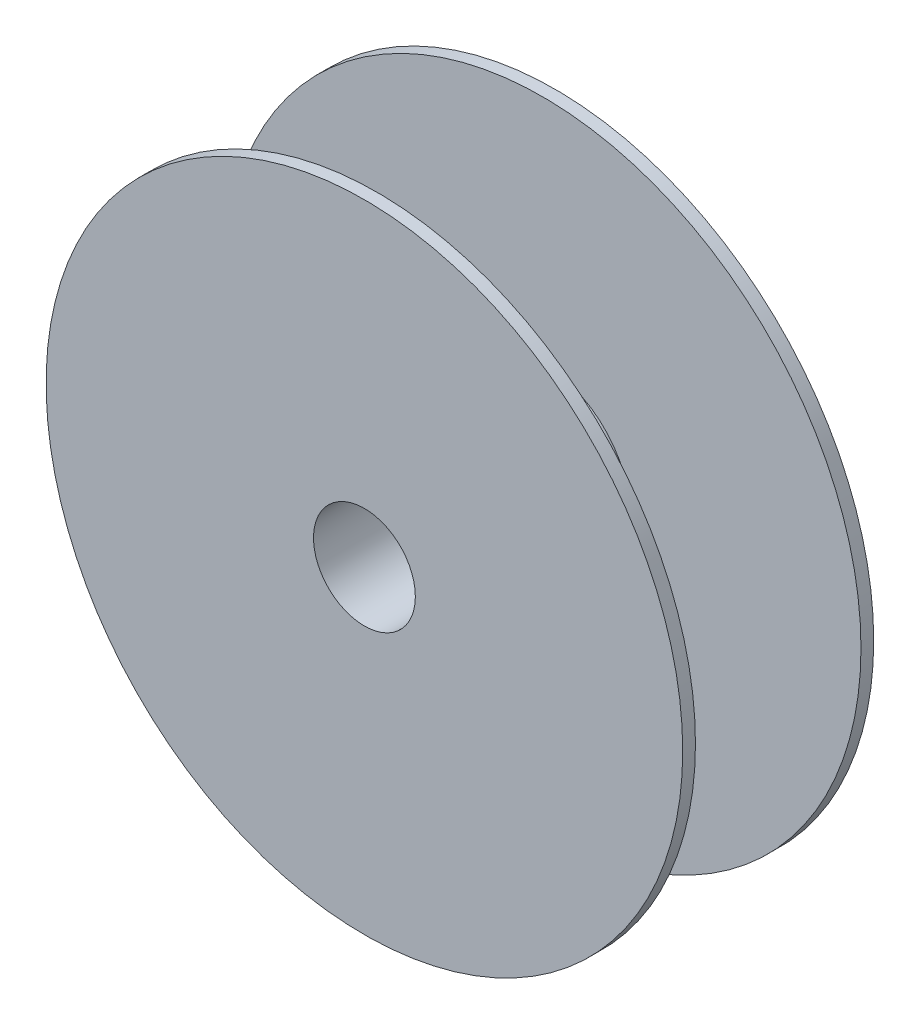
ISO-10303-21;
HEADER;
FILE_DESCRIPTION(('STEP AP214'),'2;1');
FILE_NAME('part.step','',(''),(''),'','','');
FILE_SCHEMA(('AUTOMOTIVE_DESIGN { 1 0 10303 214 1 1 1 1 }'));
ENDSEC;
DATA;
#1=APPLICATION_CONTEXT('core data for automotive mechanical design processes');
#2=APPLICATION_PROTOCOL_DEFINITION('international standard','automotive_design',2000,#1);
#3=PRODUCT_CONTEXT('',#1,'mechanical');
#4=PRODUCT('Part','Part','',(#3));
#5=PRODUCT_RELATED_PRODUCT_CATEGORY('part','',(#4));
#6=PRODUCT_DEFINITION_FORMATION('','',#4);
#7=PRODUCT_DEFINITION_CONTEXT('part definition',#1,'design');
#8=PRODUCT_DEFINITION('design','',#6,#7);
#9=PRODUCT_DEFINITION_SHAPE('','',#8);
#10=(LENGTH_UNIT() NAMED_UNIT(*) SI_UNIT(.MILLI.,.METRE.));
#11=(NAMED_UNIT(*) PLANE_ANGLE_UNIT() SI_UNIT($,.RADIAN.));
#12=(NAMED_UNIT(*) SI_UNIT($,.STERADIAN.) SOLID_ANGLE_UNIT());
#13=UNCERTAINTY_MEASURE_WITH_UNIT(LENGTH_MEASURE(1.E-05),#10,'distance_accuracy_value','');
#14=(GEOMETRIC_REPRESENTATION_CONTEXT(3) GLOBAL_UNCERTAINTY_ASSIGNED_CONTEXT((#13)) GLOBAL_UNIT_ASSIGNED_CONTEXT((#10,
#11,#12)) REPRESENTATION_CONTEXT('',''));
#15=CARTESIAN_POINT('',(0.,0.,0.));
#16=DIRECTION('',(0.,0.,1.));
#17=DIRECTION('',(1.,0.,0.));
#18=AXIS2_PLACEMENT_3D('',#15,#16,#17);
#19=CARTESIAN_POINT('',(0.,0.,30.));
#20=DIRECTION('',(0.,0.,-1.));
#21=DIRECTION('',(-1.,0.,0.));
#22=AXIS2_PLACEMENT_3D('',#19,#20,#21);
#23=CYLINDRICAL_SURFACE('',#22,100.);
#24=CARTESIAN_POINT('',(0.,0.,-30.));
#25=DIRECTION('',(0.,0.,1.));
#26=DIRECTION('',(1.,0.,0.));
#27=AXIS2_PLACEMENT_3D('',#24,#25,#26);
#28=CIRCLE('',#27,100.);
#29=CARTESIAN_POINT('',(100.,0.,-30.));
#30=VERTEX_POINT('',#29);
#31=EDGE_CURVE('E54',#30,#30,#28,.T.);
#32=ORIENTED_EDGE('',*,*,#31,.T.);
#33=EDGE_LOOP('',(#32));
#34=FACE_BOUND('',#33,.T.);
#35=CARTESIAN_POINT('',(0.,0.,-26.));
#36=DIRECTION('',(0.,0.,1.));
#37=DIRECTION('',(1.,0.,0.));
#38=AXIS2_PLACEMENT_3D('',#35,#36,#37);
#39=CIRCLE('',#38,100.);
#40=CARTESIAN_POINT('',(100.,0.,-26.));
#41=VERTEX_POINT('',#40);
#42=EDGE_CURVE('E56',#41,#41,#39,.T.);
#43=ORIENTED_EDGE('',*,*,#42,.F.);
#44=EDGE_LOOP('',(#43));
#45=FACE_BOUND('',#44,.T.);
#46=ADVANCED_FACE('F39',(#34,#45),#23,.T.);
#47=CARTESIAN_POINT('',(0.,0.,26.));
#48=DIRECTION('',(0.,0.,1.));
#49=DIRECTION('',(1.,0.,0.));
#50=AXIS2_PLACEMENT_3D('',#47,#48,#49);
#51=CIRCLE('',#50,100.);
#52=CARTESIAN_POINT('',(100.,0.,26.));
#53=VERTEX_POINT('',#52);
#54=EDGE_CURVE('E61',#53,#53,#51,.T.);
#55=ORIENTED_EDGE('',*,*,#54,.T.);
#56=EDGE_LOOP('',(#55));
#57=FACE_BOUND('',#56,.T.);
#58=CARTESIAN_POINT('',(0.,0.,30.));
#59=DIRECTION('',(0.,0.,1.));
#60=DIRECTION('',(1.,0.,0.));
#61=AXIS2_PLACEMENT_3D('',#58,#59,#60);
#62=CIRCLE('',#61,100.);
#63=CARTESIAN_POINT('',(100.,0.,30.));
#64=VERTEX_POINT('',#63);
#65=EDGE_CURVE('E47',#64,#64,#62,.T.);
#66=ORIENTED_EDGE('',*,*,#65,.F.);
#67=EDGE_LOOP('',(#66));
#68=FACE_BOUND('',#67,.T.);
#69=ADVANCED_FACE('F41',(#57,#68),#23,.T.);
#70=CARTESIAN_POINT('',(0.,0.,30.));
#71=DIRECTION('',(0.,0.,-1.));
#72=DIRECTION('',(-1.,0.,0.));
#73=AXIS2_PLACEMENT_3D('',#70,#71,#72);
#74=CYLINDRICAL_SURFACE('',#73,16.0000000040004);
#75=CARTESIAN_POINT('',(0.,0.,30.));
#76=DIRECTION('',(0.,0.,1.));
#77=DIRECTION('',(1.,0.,0.));
#78=AXIS2_PLACEMENT_3D('',#75,#76,#77);
#79=CIRCLE('',#78,16.0000000040004);
#80=CARTESIAN_POINT('',(16.0000000040004,0.,30.));
#81=VERTEX_POINT('',#80);
#82=EDGE_CURVE('E10',#81,#81,#79,.T.);
#83=ORIENTED_EDGE('',*,*,#82,.T.);
#84=EDGE_LOOP('',(#83));
#85=FACE_BOUND('',#84,.T.);
#86=CARTESIAN_POINT('',(0.,0.,-30.));
#87=DIRECTION('',(0.,0.,1.));
#88=DIRECTION('',(1.,0.,0.));
#89=AXIS2_PLACEMENT_3D('',#86,#87,#88);
#90=CIRCLE('',#89,16.0000000040004);
#91=CARTESIAN_POINT('',(16.0000000040004,0.,-30.));
#92=VERTEX_POINT('',#91);
#93=EDGE_CURVE('E43',#92,#92,#90,.T.);
#94=ORIENTED_EDGE('',*,*,#93,.F.);
#95=EDGE_LOOP('',(#94));
#96=FACE_BOUND('',#95,.T.);
#97=ADVANCED_FACE('F96',(#85,#96),#74,.F.);
#98=CARTESIAN_POINT('',(0.,0.,30.));
#99=DIRECTION('',(0.,0.,1.));
#100=DIRECTION('',(1.,0.,0.));
#101=AXIS2_PLACEMENT_3D('',#98,#99,#100);
#102=PLANE('',#101);
#103=ORIENTED_EDGE('',*,*,#65,.T.);
#104=EDGE_LOOP('',(#103));
#105=FACE_BOUND('',#104,.T.);
#106=ORIENTED_EDGE('',*,*,#82,.F.);
#107=EDGE_LOOP('',(#106));
#108=FACE_BOUND('',#107,.T.);
#109=ADVANCED_FACE('F88',(#105,#108),#102,.T.);
#110=CARTESIAN_POINT('',(0.,0.,-30.));
#111=DIRECTION('',(0.,0.,1.));
#112=DIRECTION('',(1.,0.,0.));
#113=AXIS2_PLACEMENT_3D('',#110,#111,#112);
#114=PLANE('',#113);
#115=ORIENTED_EDGE('',*,*,#31,.F.);
#116=EDGE_LOOP('',(#115));
#117=FACE_BOUND('',#116,.T.);
#118=ORIENTED_EDGE('',*,*,#93,.T.);
#119=EDGE_LOOP('',(#118));
#120=FACE_BOUND('',#119,.T.);
#121=ADVANCED_FACE('F80',(#117,#120),#114,.F.);
#122=CARTESIAN_POINT('',(0.,0.,-26.));
#123=DIRECTION('',(0.,0.,1.));
#124=DIRECTION('',(1.,0.,0.));
#125=AXIS2_PLACEMENT_3D('',#122,#123,#124);
#126=PLANE('',#125);
#127=CARTESIAN_POINT('',(0.,0.,-26.));
#128=DIRECTION('',(0.,0.,1.));
#129=DIRECTION('',(1.,0.,0.));
#130=AXIS2_PLACEMENT_3D('',#127,#128,#129);
#131=CIRCLE('',#130,27.5);
#132=CARTESIAN_POINT('',(27.5,0.,-26.));
#133=VERTEX_POINT('',#132);
#134=EDGE_CURVE('E66',#133,#133,#131,.T.);
#135=ORIENTED_EDGE('',*,*,#134,.F.);
#136=EDGE_LOOP('',(#135));
#137=FACE_BOUND('',#136,.T.);
#138=ORIENTED_EDGE('',*,*,#42,.T.);
#139=EDGE_LOOP('',(#138));
#140=FACE_BOUND('',#139,.T.);
#141=ADVANCED_FACE('F77',(#137,#140),#126,.T.);
#142=CARTESIAN_POINT('',(0.,0.,26.));
#143=DIRECTION('',(0.,0.,1.));
#144=DIRECTION('',(1.,0.,0.));
#145=AXIS2_PLACEMENT_3D('',#142,#143,#144);
#146=PLANE('',#145);
#147=CARTESIAN_POINT('',(0.,0.,26.));
#148=DIRECTION('',(0.,0.,1.));
#149=DIRECTION('',(1.,0.,0.));
#150=AXIS2_PLACEMENT_3D('',#147,#148,#149);
#151=CIRCLE('',#150,27.5);
#152=CARTESIAN_POINT('',(27.5,0.,26.));
#153=VERTEX_POINT('',#152);
#154=EDGE_CURVE('E68',#153,#153,#151,.T.);
#155=ORIENTED_EDGE('',*,*,#154,.T.);
#156=EDGE_LOOP('',(#155));
#157=FACE_BOUND('',#156,.T.);
#158=ORIENTED_EDGE('',*,*,#54,.F.);
#159=EDGE_LOOP('',(#158));
#160=FACE_BOUND('',#159,.T.);
#161=ADVANCED_FACE('F79',(#157,#160),#146,.F.);
#162=CARTESIAN_POINT('',(0.,0.,-26.));
#163=DIRECTION('',(0.,0.,1.));
#164=DIRECTION('',(1.,0.,0.));
#165=AXIS2_PLACEMENT_3D('',#162,#163,#164);
#166=CYLINDRICAL_SURFACE('',#165,27.5);
#167=CARTESIAN_POINT('',(27.5,0.,-26.));
#168=CARTESIAN_POINT('',(27.5,0.,-25.4583333333333));
#169=CARTESIAN_POINT('',(27.5,0.,-24.9166666666667));
#170=CARTESIAN_POINT('',(27.5,0.,-23.8333333333333));
#171=CARTESIAN_POINT('',(27.5,0.,-23.2916666666667));
#172=CARTESIAN_POINT('',(27.5,0.,-22.2083333333333));
#173=CARTESIAN_POINT('',(27.5,0.,-21.6666666666667));
#174=CARTESIAN_POINT('',(27.5,0.,-20.5833333333333));
#175=CARTESIAN_POINT('',(27.5,0.,-20.0416666666667));
#176=CARTESIAN_POINT('',(27.5,0.,-18.9583333333333));
#177=CARTESIAN_POINT('',(27.5,0.,-18.4166666666667));
#178=CARTESIAN_POINT('',(27.5,0.,-17.3333333333333));
#179=CARTESIAN_POINT('',(27.5,0.,-16.7916666666667));
#180=CARTESIAN_POINT('',(27.5,0.,-15.7083333333333));
#181=CARTESIAN_POINT('',(27.5,0.,-15.1666666666667));
#182=CARTESIAN_POINT('',(27.5,0.,-14.0833333333333));
#183=CARTESIAN_POINT('',(27.5,0.,-13.5416666666667));
#184=CARTESIAN_POINT('',(27.5,0.,-12.4583333333333));
#185=CARTESIAN_POINT('',(27.5,0.,-11.9166666666667));
#186=CARTESIAN_POINT('',(27.5,0.,-10.8333333333333));
#187=CARTESIAN_POINT('',(27.5,0.,-10.2916666666667));
#188=CARTESIAN_POINT('',(27.5,0.,-9.20833333333333));
#189=CARTESIAN_POINT('',(27.5,0.,-8.66666666666667));
#190=CARTESIAN_POINT('',(27.5,0.,-7.58333333333333));
#191=CARTESIAN_POINT('',(27.5,0.,-7.04166666666667));
#192=CARTESIAN_POINT('',(27.5,0.,-5.95833333333333));
#193=CARTESIAN_POINT('',(27.5,0.,-5.41666666666667));
#194=CARTESIAN_POINT('',(27.5,0.,-4.33333333333333));
#195=CARTESIAN_POINT('',(27.5,0.,-3.79166666666667));
#196=CARTESIAN_POINT('',(27.5,0.,-2.70833333333333));
#197=CARTESIAN_POINT('',(27.5,0.,-2.16666666666667));
#198=CARTESIAN_POINT('',(27.5,0.,-1.08333333333333));
#199=CARTESIAN_POINT('',(27.5,0.,-0.541666666666667));
#200=CARTESIAN_POINT('',(27.5,0.,0.541666666666667));
#201=CARTESIAN_POINT('',(27.5,0.,1.08333333333333));
#202=CARTESIAN_POINT('',(27.5,0.,2.16666666666667));
#203=CARTESIAN_POINT('',(27.5,0.,2.70833333333333));
#204=CARTESIAN_POINT('',(27.5,0.,3.79166666666667));
#205=CARTESIAN_POINT('',(27.5,0.,4.33333333333333));
#206=CARTESIAN_POINT('',(27.5,0.,5.41666666666667));
#207=CARTESIAN_POINT('',(27.5,0.,5.95833333333333));
#208=CARTESIAN_POINT('',(27.5,0.,7.04166666666666));
#209=CARTESIAN_POINT('',(27.5,0.,7.58333333333333));
#210=CARTESIAN_POINT('',(27.5,0.,8.66666666666666));
#211=CARTESIAN_POINT('',(27.5,0.,9.20833333333333));
#212=CARTESIAN_POINT('',(27.5,0.,10.2916666666667));
#213=CARTESIAN_POINT('',(27.5,0.,10.8333333333333));
#214=CARTESIAN_POINT('',(27.5,0.,11.9166666666667));
#215=CARTESIAN_POINT('',(27.5,0.,12.4583333333333));
#216=CARTESIAN_POINT('',(27.5,0.,13.5416666666667));
#217=CARTESIAN_POINT('',(27.5,0.,14.0833333333333));
#218=CARTESIAN_POINT('',(27.5,0.,15.1666666666667));
#219=CARTESIAN_POINT('',(27.5,0.,15.7083333333333));
#220=CARTESIAN_POINT('',(27.5,0.,16.7916666666667));
#221=CARTESIAN_POINT('',(27.5,0.,17.3333333333333));
#222=CARTESIAN_POINT('',(27.5,0.,18.4166666666667));
#223=CARTESIAN_POINT('',(27.5,0.,18.9583333333333));
#224=CARTESIAN_POINT('',(27.5,0.,20.0416666666667));
#225=CARTESIAN_POINT('',(27.5,0.,20.5833333333333));
#226=CARTESIAN_POINT('',(27.5,0.,21.6666666666667));
#227=CARTESIAN_POINT('',(27.5,0.,22.2083333333333));
#228=CARTESIAN_POINT('',(27.5,0.,23.2916666666667));
#229=CARTESIAN_POINT('',(27.5,0.,23.8333333333333));
#230=CARTESIAN_POINT('',(27.5,0.,24.9166666666667));
#231=CARTESIAN_POINT('',(27.5,0.,25.4583333333333));
#232=CARTESIAN_POINT('',(27.5,0.,26.));
#233=B_SPLINE_CURVE_WITH_KNOTS('',3,(#167,#168,#169,#170,#171,#172,#173,#174,#175,#176,#177,
#178,#179,#180,#181,#182,#183,#184,#185,#186,#187,#188,#189,#190,#191,#192,#193,#194,#195,#196,
#197,#198,#199,#200,#201,#202,#203,#204,#205,#206,#207,#208,#209,#210,#211,#212,#213,#214,#215,
#216,#217,#218,#219,#220,#221,#222,#223,#224,#225,#226,#227,#228,#229,#230,#231,#232),
.UNSPECIFIED.,.F.,.F.,(4,2,2,2,2,2,2,2,2,2,2,2,2,2,2,2,2,2,2,2,2,2,2,2,2,2,2,2,2,2,2,2,4),(0.,
1.625,3.25,4.875,6.5,8.125,9.75,11.375,13.,14.625,16.25,17.875,19.5,21.125,22.75,24.375,26.,
27.625,29.25,30.875,32.5,34.125,35.75,37.375,39.,40.625,42.25,43.875,45.5,47.125,48.75,50.375,
52.),.UNSPECIFIED.);
#234=EDGE_CURVE('BSEAM74',#133,#153,#233,.T.);
#235=ORIENTED_EDGE('',*,*,#134,.T.);
#236=ORIENTED_EDGE('',*,*,#154,.F.);
#237=ORIENTED_EDGE('',*,*,#234,.T.);
#238=ORIENTED_EDGE('',*,*,#234,.F.);
#239=EDGE_LOOP('',(#235,#237,#236,#238));
#240=FACE_BOUND('',#239,.T.);
#241=ADVANCED_FACE('F74',(#240),#166,.T.);
#242=CLOSED_SHELL('',(#46,#69,#97,#109,#121,#141,#161,#241));
#243=MANIFOLD_SOLID_BREP('B2',#242);
#244=ADVANCED_BREP_SHAPE_REPRESENTATION('',(#18,#243),#14);
#245=SHAPE_DEFINITION_REPRESENTATION(#9,#244);
ENDSEC;
END-ISO-10303-21;
